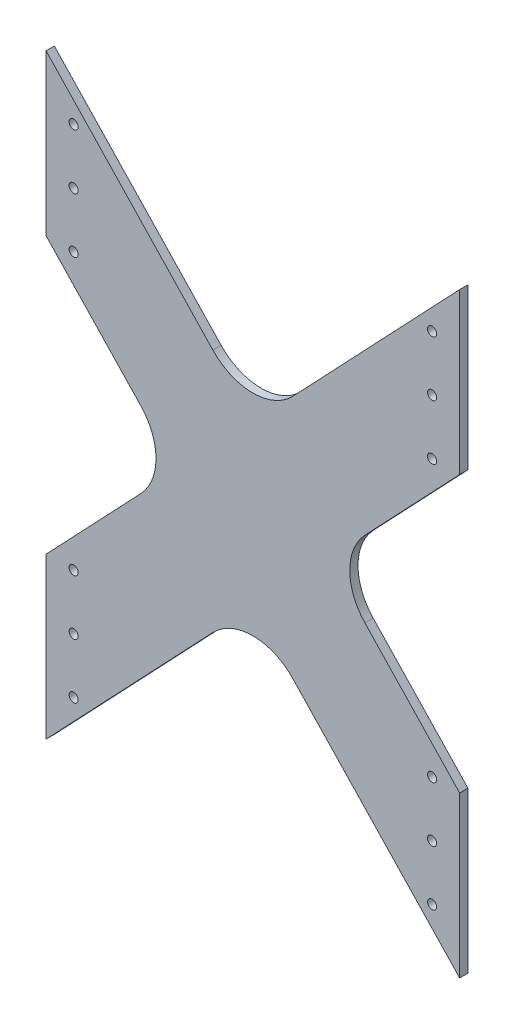
ISO-10303-21;
HEADER;
FILE_DESCRIPTION(('STEP AP214'),'2;1');
FILE_NAME('part.step','',(''),(''),'','','');
FILE_SCHEMA(('AUTOMOTIVE_DESIGN { 1 0 10303 214 1 1 1 1 }'));
ENDSEC;
DATA;
#1=APPLICATION_CONTEXT('core data for automotive mechanical design processes');
#2=APPLICATION_PROTOCOL_DEFINITION('international standard','automotive_design',2000,#1);
#3=PRODUCT_CONTEXT('',#1,'mechanical');
#4=PRODUCT('Part','Part','',(#3));
#5=PRODUCT_RELATED_PRODUCT_CATEGORY('part','',(#4));
#6=PRODUCT_DEFINITION_FORMATION('','',#4);
#7=PRODUCT_DEFINITION_CONTEXT('part definition',#1,'design');
#8=PRODUCT_DEFINITION('design','',#6,#7);
#9=PRODUCT_DEFINITION_SHAPE('','',#8);
#10=(LENGTH_UNIT() NAMED_UNIT(*) SI_UNIT(.MILLI.,.METRE.));
#11=(NAMED_UNIT(*) PLANE_ANGLE_UNIT() SI_UNIT($,.RADIAN.));
#12=(NAMED_UNIT(*) SI_UNIT($,.STERADIAN.) SOLID_ANGLE_UNIT());
#13=UNCERTAINTY_MEASURE_WITH_UNIT(LENGTH_MEASURE(1.E-05),#10,'distance_accuracy_value','');
#14=(GEOMETRIC_REPRESENTATION_CONTEXT(3) GLOBAL_UNCERTAINTY_ASSIGNED_CONTEXT((#13)) GLOBAL_UNIT_ASSIGNED_CONTEXT((#10,
#11,#12)) REPRESENTATION_CONTEXT('',''));
#15=CARTESIAN_POINT('',(0.,0.,0.));
#16=DIRECTION('',(0.,0.,1.));
#17=DIRECTION('',(1.,0.,0.));
#18=AXIS2_PLACEMENT_3D('',#15,#16,#17);
#19=CARTESIAN_POINT('',(-27.7267674180202,26.3033579146471,3.));
#20=DIRECTION('',(-0.725483608621301,0.688239444976684,0.));
#21=DIRECTION('',(-0.688239444976685,-0.725483608621301,0.));
#22=AXIS2_PLACEMENT_3D('',#19,#20,#21);
#23=PLANE('',#22);
#24=DIRECTION('',(0.688239444976685,0.725483608621301,0.));
#25=VECTOR('',#24,1.);
#26=CARTESIAN_POINT('',(-27.7267674180202,26.3033579146471,0.));
#27=LINE('',#26,#25);
#28=CARTESIAN_POINT('',(8.35018483751891,64.3326189537228,0.));
#29=VERTEX_POINT('',#28);
#30=CARTESIAN_POINT('',(68.8408597181721,128.096754271251,0.));
#31=VERTEX_POINT('',#30);
#32=EDGE_CURVE('E244',#29,#31,#27,.T.);
#33=ORIENTED_EDGE('',*,*,#32,.F.);
#34=DIRECTION('',(0.,0.,-1.));
#35=VECTOR('',#34,1.);
#36=CARTESIAN_POINT('',(8.35018483751891,64.3326189537228,3.));
#37=LINE('',#36,#35);
#38=CARTESIAN_POINT('',(8.35018483751891,64.3326189537228,3.));
#39=VERTEX_POINT('',#38);
#40=EDGE_CURVE('E58',#29,#39,#37,.F.);
#41=ORIENTED_EDGE('',*,*,#40,.T.);
#42=DIRECTION('',(0.688239444976685,0.725483608621301,0.));
#43=VECTOR('',#42,1.);
#44=CARTESIAN_POINT('',(-27.7267674180202,26.3033579146471,3.));
#45=LINE('',#44,#43);
#46=CARTESIAN_POINT('',(68.8408597181721,128.096754271251,3.));
#47=VERTEX_POINT('',#46);
#48=EDGE_CURVE('E165',#39,#47,#45,.T.);
#49=ORIENTED_EDGE('',*,*,#48,.T.);
#50=DIRECTION('',(0.,0.,-1.));
#51=VECTOR('',#50,1.);
#52=CARTESIAN_POINT('',(68.8408597181721,128.096754271251,3.));
#53=LINE('',#52,#51);
#54=EDGE_CURVE('E243',#47,#31,#53,.T.);
#55=ORIENTED_EDGE('',*,*,#54,.T.);
#56=EDGE_LOOP('',(#33,#41,#49,#55));
#57=FACE_BOUND('',#56,.T.);
#58=ADVANCED_FACE('F43',(#57),#23,.T.);
#59=CARTESIAN_POINT('',(21.2428723521481,20.1521710330634,3.));
#60=DIRECTION('',(-0.725486262647714,-0.688236647316497,0.));
#61=DIRECTION('',(0.688236647316497,-0.725486262647714,0.));
#62=AXIS2_PLACEMENT_3D('',#59,#60,#61);
#63=PLANE('',#62);
#64=DIRECTION('',(-0.688236647316497,0.725486262647714,0.));
#65=VECTOR('',#64,1.);
#66=CARTESIAN_POINT('',(21.2428723521481,20.1521710330634,3.));
#67=LINE('',#66,#65);
#68=CARTESIAN_POINT('',(-20.6692125878614,64.3326749069265,3.));
#69=VERTEX_POINT('',#68);
#70=CARTESIAN_POINT('',(-81.1596415768353,128.097043491889,3.));
#71=VERTEX_POINT('',#70);
#72=EDGE_CURVE('E153',#69,#71,#67,.T.);
#73=ORIENTED_EDGE('',*,*,#72,.F.);
#74=DIRECTION('',(0.,0.,-1.));
#75=VECTOR('',#74,1.);
#76=CARTESIAN_POINT('',(-20.6692125878614,64.3326749069265,3.));
#77=LINE('',#76,#75);
#78=CARTESIAN_POINT('',(-20.6692125878614,64.3326749069265,0.));
#79=VERTEX_POINT('',#78);
#80=EDGE_CURVE('E339',#69,#79,#77,.T.);
#81=ORIENTED_EDGE('',*,*,#80,.T.);
#82=DIRECTION('',(-0.688236647316497,0.725486262647714,0.));
#83=VECTOR('',#82,1.);
#84=CARTESIAN_POINT('',(21.2428723521481,20.1521710330634,0.));
#85=LINE('',#84,#83);
#86=CARTESIAN_POINT('',(-81.1596415768353,128.097043491889,0.));
#87=VERTEX_POINT('',#86);
#88=EDGE_CURVE('E170',#79,#87,#85,.T.);
#89=ORIENTED_EDGE('',*,*,#88,.T.);
#90=DIRECTION('',(0.,0.,-1.));
#91=VECTOR('',#90,1.);
#92=CARTESIAN_POINT('',(-81.1596415768353,128.097043491889,3.));
#93=LINE('',#92,#91);
#94=EDGE_CURVE('E168',#71,#87,#93,.T.);
#95=ORIENTED_EDGE('',*,*,#94,.F.);
#96=EDGE_LOOP('',(#73,#81,#89,#95));
#97=FACE_BOUND('',#96,.T.);
#98=ADVANCED_FACE('F169',(#97),#63,.F.);
#99=CARTESIAN_POINT('',(-81.1604606199397,0.000518936137093081,3.));
#100=DIRECTION('',(0.999999999979559,-6.39395258625454E-06,0.));
#101=DIRECTION('',(6.39395258625454E-06,0.999999999979559,0.));
#102=AXIS2_PLACEMENT_3D('',#99,#100,#101);
#103=PLANE('',#102);
#104=DIRECTION('',(-6.39395258625454E-06,-0.999999999979559,0.));
#105=VECTOR('',#104,1.);
#106=CARTESIAN_POINT('',(-81.1604606199397,0.000518936137093081,0.));
#107=LINE('',#106,#105);
#108=CARTESIAN_POINT('',(-81.1600131879383,69.9778913699945,0.));
#109=VERTEX_POINT('',#108);
#110=EDGE_CURVE('E247',#87,#109,#107,.T.);
#111=ORIENTED_EDGE('',*,*,#110,.T.);
#112=DIRECTION('',(0.,0.,-1.));
#113=VECTOR('',#112,1.);
#114=CARTESIAN_POINT('',(-81.1600131879383,69.9778913699945,3.));
#115=LINE('',#114,#113);
#116=CARTESIAN_POINT('',(-81.1600131879383,69.9778913699945,3.));
#117=VERTEX_POINT('',#116);
#118=EDGE_CURVE('E174',#117,#109,#115,.T.);
#119=ORIENTED_EDGE('',*,*,#118,.F.);
#120=DIRECTION('',(-6.39395258625454E-06,-0.999999999979559,0.));
#121=VECTOR('',#120,1.);
#122=CARTESIAN_POINT('',(-81.1604606199397,0.000518936137093081,3.));
#123=LINE('',#122,#121);
#124=EDGE_CURVE('E159',#71,#117,#123,.T.);
#125=ORIENTED_EDGE('',*,*,#124,.F.);
#126=ORIENTED_EDGE('',*,*,#94,.T.);
#127=EDGE_LOOP('',(#111,#119,#125,#126));
#128=FACE_BOUND('',#127,.T.);
#129=ADVANCED_FACE('F176',(#128),#103,.F.);
#130=CARTESIAN_POINT('',(-7.77657815376051,-7.37729485959649,3.));
#131=DIRECTION('',(0.725486262647714,0.688236647316497,0.));
#132=DIRECTION('',(-0.688236647316497,0.725486262647714,0.));
#133=AXIS2_PLACEMENT_3D('',#130,#131,#132);
#134=PLANE('',#133);
#135=DIRECTION('',(0.688236647316497,-0.725486262647714,0.));
#136=VECTOR('',#135,1.);
#137=CARTESIAN_POINT('',(-7.77657815376051,-7.37729485959649,0.));
#138=LINE('',#137,#136);
#139=CARTESIAN_POINT('',(-46.7854090600242,33.7428213893534,0.));
#140=VERTEX_POINT('',#139);
#141=EDGE_CURVE('E249',#109,#140,#138,.T.);
#142=ORIENTED_EDGE('',*,*,#141,.T.);
#143=DIRECTION('',(0.,0.,-1.));
#144=VECTOR('',#143,1.);
#145=CARTESIAN_POINT('',(-46.7854090600242,33.7428213893534,3.));
#146=LINE('',#145,#144);
#147=CARTESIAN_POINT('',(-46.7854090600242,33.7428213893534,3.));
#148=VERTEX_POINT('',#147);
#149=EDGE_CURVE('E327',#140,#148,#146,.F.);
#150=ORIENTED_EDGE('',*,*,#149,.T.);
#151=DIRECTION('',(0.688236647316497,-0.725486262647714,0.));
#152=VECTOR('',#151,1.);
#153=CARTESIAN_POINT('',(-7.77657815376051,-7.37729485959649,3.));
#154=LINE('',#153,#152);
#155=EDGE_CURVE('E179',#117,#148,#154,.T.);
#156=ORIENTED_EDGE('',*,*,#155,.F.);
#157=ORIENTED_EDGE('',*,*,#118,.T.);
#158=EDGE_LOOP('',(#142,#150,#156,#157));
#159=FACE_BOUND('',#158,.T.);
#160=ADVANCED_FACE('F402',(#159),#134,.F.);
#161=CARTESIAN_POINT('',(-27.7267674180203,26.303357914647,3.));
#162=DIRECTION('',(-0.725483608621303,0.688239444976682,0.));
#163=DIRECTION('',(-0.688239444976683,-0.725483608621303,0.));
#164=AXIS2_PLACEMENT_3D('',#161,#162,#163);
#165=PLANE('',#164);
#166=DIRECTION('',(0.688239444976683,0.725483608621303,0.));
#167=VECTOR('',#166,1.);
#168=CARTESIAN_POINT('',(-27.7267674180203,26.303357914647,3.));
#169=LINE('',#168,#167);
#170=CARTESIAN_POINT('',(-81.1606525831967,-30.0221086293432,3.));
#171=VERTEX_POINT('',#170);
#172=CARTESIAN_POINT('',(-46.7854621405524,6.21329954348978,3.));
#173=VERTEX_POINT('',#172);
#174=EDGE_CURVE('E181',#171,#173,#169,.T.);
#175=ORIENTED_EDGE('',*,*,#174,.T.);
#176=DIRECTION('',(0.,0.,-1.));
#177=VECTOR('',#176,1.);
#178=CARTESIAN_POINT('',(-46.7854621405524,6.21329954348978,3.));
#179=LINE('',#178,#177);
#180=CARTESIAN_POINT('',(-46.7854621405524,6.21329954348978,0.));
#181=VERTEX_POINT('',#180);
#182=EDGE_CURVE('E173',#173,#181,#179,.T.);
#183=ORIENTED_EDGE('',*,*,#182,.T.);
#184=DIRECTION('',(0.688239444976683,0.725483608621303,0.));
#185=VECTOR('',#184,1.);
#186=CARTESIAN_POINT('',(-27.7267674180203,26.303357914647,0.));
#187=LINE('',#186,#185);
#188=CARTESIAN_POINT('',(-81.1606525831967,-30.0221086293432,0.));
#189=VERTEX_POINT('',#188);
#190=EDGE_CURVE('E252',#189,#181,#187,.T.);
#191=ORIENTED_EDGE('',*,*,#190,.F.);
#192=DIRECTION('',(0.,0.,-1.));
#193=VECTOR('',#192,1.);
#194=CARTESIAN_POINT('',(-81.1606525831967,-30.0221086293432,3.));
#195=LINE('',#194,#193);
#196=EDGE_CURVE('E322',#171,#189,#195,.T.);
#197=ORIENTED_EDGE('',*,*,#196,.F.);
#198=EDGE_LOOP('',(#175,#183,#191,#197));
#199=FACE_BOUND('',#198,.T.);
#200=ADVANCED_FACE('F394',(#199),#165,.T.);
#201=CARTESIAN_POINT('',(-81.1604606199396,0.000518936136785701,3.));
#202=DIRECTION('',(-0.999999999979559,6.39395258246723E-06,0.));
#203=DIRECTION('',(-6.39395258246723E-06,-0.999999999979559,0.));
#204=AXIS2_PLACEMENT_3D('',#201,#202,#203);
#205=PLANE('',#204);
#206=DIRECTION('',(6.39395258246723E-06,0.999999999979559,0.));
#207=VECTOR('',#206,1.);
#208=CARTESIAN_POINT('',(-81.1604606199396,0.000518936136785701,0.));
#209=LINE('',#208,#207);
#210=CARTESIAN_POINT('',(-81.1610241977982,-88.1418079465734,0.));
#211=VERTEX_POINT('',#210);
#212=EDGE_CURVE('E255',#211,#189,#209,.T.);
#213=ORIENTED_EDGE('',*,*,#212,.F.);
#214=DIRECTION('',(0.,0.,-1.));
#215=VECTOR('',#214,1.);
#216=CARTESIAN_POINT('',(-81.1610241977982,-88.1418079465734,3.));
#217=LINE('',#216,#215);
#218=CARTESIAN_POINT('',(-81.1610241977982,-88.1418079465734,3.));
#219=VERTEX_POINT('',#218);
#220=EDGE_CURVE('E320',#219,#211,#217,.T.);
#221=ORIENTED_EDGE('',*,*,#220,.F.);
#222=DIRECTION('',(6.39395258246723E-06,0.999999999979559,0.));
#223=VECTOR('',#222,1.);
#224=CARTESIAN_POINT('',(-81.1604606199396,0.000518936136785701,3.));
#225=LINE('',#224,#223);
#226=EDGE_CURVE('E187',#219,#171,#225,.T.);
#227=ORIENTED_EDGE('',*,*,#226,.T.);
#228=ORIENTED_EDGE('',*,*,#196,.T.);
#229=EDGE_LOOP('',(#213,#221,#227,#228));
#230=FACE_BOUND('',#229,.T.);
#231=ADVANCED_FACE('F390',(#230),#205,.T.);
#232=CARTESIAN_POINT('',(1.29257692683187,-1.22621988442029,3.));
#233=DIRECTION('',(-0.725483608621303,0.688239444976682,0.));
#234=DIRECTION('',(-0.688239444976682,-0.725483608621303,0.));
#235=AXIS2_PLACEMENT_3D('',#232,#233,#234);
#236=PLANE('',#235);
#237=DIRECTION('',(0.688239444976682,0.725483608621303,0.));
#238=VECTOR('',#237,1.);
#239=CARTESIAN_POINT('',(1.29257692683187,-1.22621988442029,0.));
#240=LINE('',#239,#238);
#241=CARTESIAN_POINT('',(-20.6693836310819,-24.3766546847591,0.));
#242=VERTEX_POINT('',#241);
#243=EDGE_CURVE('E258',#211,#242,#240,.T.);
#244=ORIENTED_EDGE('',*,*,#243,.T.);
#245=DIRECTION('',(0.,0.,-1.));
#246=VECTOR('',#245,1.);
#247=CARTESIAN_POINT('',(-20.6693836310819,-24.3766546847591,3.));
#248=LINE('',#247,#246);
#249=CARTESIAN_POINT('',(-20.6693836310819,-24.3766546847591,3.));
#250=VERTEX_POINT('',#249);
#251=EDGE_CURVE('E332',#242,#250,#248,.F.);
#252=ORIENTED_EDGE('',*,*,#251,.T.);
#253=DIRECTION('',(0.688239444976682,0.725483608621303,0.));
#254=VECTOR('',#253,1.);
#255=CARTESIAN_POINT('',(1.29257692683187,-1.22621988442029,3.));
#256=LINE('',#255,#254);
#257=EDGE_CURVE('E190',#219,#250,#256,.T.);
#258=ORIENTED_EDGE('',*,*,#257,.F.);
#259=ORIENTED_EDGE('',*,*,#220,.T.);
#260=EDGE_LOOP('',(#244,#252,#258,#259));
#261=FACE_BOUND('',#260,.T.);
#262=ADVANCED_FACE('F386',(#261),#236,.F.);
#263=CARTESIAN_POINT('',(-7.77657815376049,-7.37729485959641,3.));
#264=DIRECTION('',(-0.725486262647716,-0.688236647316494,0.));
#265=DIRECTION('',(0.688236647316494,-0.725486262647716,0.));
#266=AXIS2_PLACEMENT_3D('',#263,#264,#265);
#267=PLANE('',#266);
#268=DIRECTION('',(-0.688236647316494,0.725486262647717,0.));
#269=VECTOR('',#268,1.);
#270=CARTESIAN_POINT('',(-7.77657815376049,-7.37729485959641,3.));
#271=LINE('',#270,#269);
#272=CARTESIAN_POINT('',(68.84140846541,-88.1420971709345,3.));
#273=VERTEX_POINT('',#272);
#274=CARTESIAN_POINT('',(8.35001379429845,-24.3767106379629,3.));
#275=VERTEX_POINT('',#274);
#276=EDGE_CURVE('E193',#273,#275,#271,.T.);
#277=ORIENTED_EDGE('',*,*,#276,.T.);
#278=DIRECTION('',(0.,0.,-1.));
#279=VECTOR('',#278,1.);
#280=CARTESIAN_POINT('',(8.35001379429844,-24.3767106379629,3.));
#281=LINE('',#280,#279);
#282=CARTESIAN_POINT('',(8.35001379429845,-24.3767106379629,0.));
#283=VERTEX_POINT('',#282);
#284=EDGE_CURVE('E329',#275,#283,#281,.T.);
#285=ORIENTED_EDGE('',*,*,#284,.T.);
#286=DIRECTION('',(-0.688236647316494,0.725486262647717,0.));
#287=VECTOR('',#286,1.);
#288=CARTESIAN_POINT('',(-7.77657815376049,-7.37729485959641,0.));
#289=LINE('',#288,#287);
#290=CARTESIAN_POINT('',(68.84140846541,-88.1420971709345,0.));
#291=VERTEX_POINT('',#290);
#292=EDGE_CURVE('E261',#291,#283,#289,.T.);
#293=ORIENTED_EDGE('',*,*,#292,.F.);
#294=DIRECTION('',(0.,0.,-1.));
#295=VECTOR('',#294,1.);
#296=CARTESIAN_POINT('',(68.84140846541,-88.1420971709345,3.));
#297=LINE('',#296,#295);
#298=EDGE_CURVE('E318',#273,#291,#297,.T.);
#299=ORIENTED_EDGE('',*,*,#298,.F.);
#300=EDGE_LOOP('',(#277,#285,#293,#299));
#301=FACE_BOUND('',#300,.T.);
#302=ADVANCED_FACE('F377',(#301),#267,.T.);
#303=CARTESIAN_POINT('',(68.841184787621,0.000174697607430225,3.));
#304=DIRECTION('',(-0.99999999999678,-2.53769030804183E-06,0.));
#305=DIRECTION('',(2.53769030804183E-06,-0.99999999999678,0.));
#306=AXIS2_PLACEMENT_3D('',#303,#304,#305);
#307=PLANE('',#306);
#308=DIRECTION('',(-2.53769030804183E-06,0.99999999999678,0.));
#309=VECTOR('',#308,1.);
#310=CARTESIAN_POINT('',(68.841184787621,0.000174697607430225,0.));
#311=LINE('',#310,#309);
#312=CARTESIAN_POINT('',(68.8412609756123,-30.0223978527034,0.));
#313=VERTEX_POINT('',#312);
#314=EDGE_CURVE('E264',#291,#313,#311,.T.);
#315=ORIENTED_EDGE('',*,*,#314,.T.);
#316=DIRECTION('',(0.,0.,-1.));
#317=VECTOR('',#316,1.);
#318=CARTESIAN_POINT('',(68.8412609756123,-30.0223978527034,3.));
#319=LINE('',#318,#317);
#320=CARTESIAN_POINT('',(68.8412609756123,-30.0223978527034,3.));
#321=VERTEX_POINT('',#320);
#322=EDGE_CURVE('E315',#321,#313,#319,.T.);
#323=ORIENTED_EDGE('',*,*,#322,.F.);
#324=DIRECTION('',(-2.53769030804183E-06,0.99999999999678,0.));
#325=VECTOR('',#324,1.);
#326=CARTESIAN_POINT('',(68.841184787621,0.000174697607430225,3.));
#327=LINE('',#326,#325);
#328=EDGE_CURVE('E196',#273,#321,#327,.T.);
#329=ORIENTED_EDGE('',*,*,#328,.F.);
#330=ORIENTED_EDGE('',*,*,#298,.T.);
#331=EDGE_LOOP('',(#315,#323,#329,#330));
#332=FACE_BOUND('',#331,.T.);
#333=ADVANCED_FACE('F373',(#332),#307,.F.);
#334=CARTESIAN_POINT('',(21.2428723521482,20.1521710330634,3.));
#335=DIRECTION('',(-0.725486262647716,-0.688236647316495,0.));
#336=DIRECTION('',(0.688236647316495,-0.725486262647716,0.));
#337=AXIS2_PLACEMENT_3D('',#334,#335,#336);
#338=PLANE('',#337);
#339=DIRECTION('',(-0.688236647316495,0.725486262647716,0.));
#340=VECTOR('',#339,1.);
#341=CARTESIAN_POINT('',(21.2428723521482,20.1521710330634,0.));
#342=LINE('',#341,#340);
#343=CARTESIAN_POINT('',(34.4662102664611,6.21314287961037,0.));
#344=VERTEX_POINT('',#343);
#345=EDGE_CURVE('E266',#313,#344,#342,.T.);
#346=ORIENTED_EDGE('',*,*,#345,.T.);
#347=DIRECTION('',(0.,0.,-1.));
#348=VECTOR('',#347,1.);
#349=CARTESIAN_POINT('',(34.4662102664611,6.21314287961037,3.));
#350=LINE('',#349,#348);
#351=CARTESIAN_POINT('',(34.4662102664611,6.21314287961037,3.));
#352=VERTEX_POINT('',#351);
#353=EDGE_CURVE('E337',#344,#352,#350,.F.);
#354=ORIENTED_EDGE('',*,*,#353,.T.);
#355=DIRECTION('',(-0.688236647316495,0.725486262647716,0.));
#356=VECTOR('',#355,1.);
#357=CARTESIAN_POINT('',(21.2428723521482,20.1521710330634,3.));
#358=LINE('',#357,#356);
#359=EDGE_CURVE('E198',#321,#352,#358,.T.);
#360=ORIENTED_EDGE('',*,*,#359,.F.);
#361=ORIENTED_EDGE('',*,*,#322,.T.);
#362=EDGE_LOOP('',(#346,#354,#360,#361));
#363=FACE_BOUND('',#362,.T.);
#364=ADVANCED_FACE('F369',(#363),#338,.F.);
#365=CARTESIAN_POINT('',(1.29257692683173,-1.22621988442018,3.));
#366=DIRECTION('',(0.725483608621299,-0.688239444976687,0.));
#367=DIRECTION('',(0.688239444976687,0.725483608621299,0.));
#368=AXIS2_PLACEMENT_3D('',#365,#366,#367);
#369=PLANE('',#368);
#370=DIRECTION('',(-0.688239444976687,-0.725483608621299,0.));
#371=VECTOR('',#370,1.);
#372=CARTESIAN_POINT('',(1.29257692683173,-1.22621988442018,3.));
#373=LINE('',#372,#371);
#374=CARTESIAN_POINT('',(68.8410072065813,69.9776021483565,3.));
#375=VERTEX_POINT('',#374);
#376=CARTESIAN_POINT('',(34.4662633469894,33.742664725474,3.));
#377=VERTEX_POINT('',#376);
#378=EDGE_CURVE('E201',#375,#377,#373,.T.);
#379=ORIENTED_EDGE('',*,*,#378,.T.);
#380=DIRECTION('',(0.,0.,-1.));
#381=VECTOR('',#380,1.);
#382=CARTESIAN_POINT('',(34.4662633469894,33.742664725474,3.));
#383=LINE('',#382,#381);
#384=CARTESIAN_POINT('',(34.4662633469894,33.742664725474,0.));
#385=VERTEX_POINT('',#384);
#386=EDGE_CURVE('E334',#377,#385,#383,.T.);
#387=ORIENTED_EDGE('',*,*,#386,.T.);
#388=DIRECTION('',(-0.688239444976687,-0.725483608621299,0.));
#389=VECTOR('',#388,1.);
#390=CARTESIAN_POINT('',(1.29257692683173,-1.22621988442018,0.));
#391=LINE('',#390,#389);
#392=CARTESIAN_POINT('',(68.8410072065813,69.9776021483565,0.));
#393=VERTEX_POINT('',#392);
#394=EDGE_CURVE('E269',#393,#385,#391,.T.);
#395=ORIENTED_EDGE('',*,*,#394,.F.);
#396=DIRECTION('',(0.,0.,-1.));
#397=VECTOR('',#396,1.);
#398=CARTESIAN_POINT('',(68.8410072065813,69.9776021483565,3.));
#399=LINE('',#398,#397);
#400=EDGE_CURVE('E313',#375,#393,#399,.T.);
#401=ORIENTED_EDGE('',*,*,#400,.F.);
#402=EDGE_LOOP('',(#379,#387,#395,#401));
#403=FACE_BOUND('',#402,.T.);
#404=ADVANCED_FACE('F361',(#403),#369,.T.);
#405=CARTESIAN_POINT('',(58.8409056988909,109.977620360612,3.));
#406=DIRECTION('',(0.,0.,-1.));
#407=DIRECTION('',(-1.,0.,0.));
#408=AXIS2_PLACEMENT_3D('',#405,#406,#407);
#409=CYLINDRICAL_SURFACE('',#408,1.64999999999997);
#410=CARTESIAN_POINT('',(58.8409056988909,109.977620360612,3.));
#411=DIRECTION('',(0.,0.,1.));
#412=DIRECTION('',(1.,0.,0.));
#413=AXIS2_PLACEMENT_3D('',#410,#411,#412);
#414=CIRCLE('',#413,1.64999999999997);
#415=CARTESIAN_POINT('',(60.4909056988909,109.977620360612,3.));
#416=VERTEX_POINT('',#415);
#417=EDGE_CURVE('E237',#416,#416,#414,.F.);
#418=ORIENTED_EDGE('',*,*,#417,.F.);
#419=EDGE_LOOP('',(#418));
#420=FACE_BOUND('',#419,.T.);
#421=CARTESIAN_POINT('',(58.8409056988909,109.977620360612,0.));
#422=DIRECTION('',(0.,0.,1.));
#423=DIRECTION('',(1.,0.,0.));
#424=AXIS2_PLACEMENT_3D('',#421,#422,#423);
#425=CIRCLE('',#424,1.64999999999997);
#426=CARTESIAN_POINT('',(60.4909056988909,109.977620360612,0.));
#427=VERTEX_POINT('',#426);
#428=EDGE_CURVE('E305',#427,#427,#425,.F.);
#429=ORIENTED_EDGE('',*,*,#428,.T.);
#430=EDGE_LOOP('',(#429));
#431=FACE_BOUND('',#430,.T.);
#432=ADVANCED_FACE('F582',(#420,#431),#409,.F.);
#433=CARTESIAN_POINT('',(58.8413117292885,-50.0223592900162,3.));
#434=DIRECTION('',(0.,0.,-1.));
#435=DIRECTION('',(-1.,0.,0.));
#436=AXIS2_PLACEMENT_3D('',#433,#434,#435);
#437=CYLINDRICAL_SURFACE('',#436,1.64999999999958);
#438=CARTESIAN_POINT('',(58.8413117292885,-50.0223592900162,3.));
#439=DIRECTION('',(0.,0.,1.));
#440=DIRECTION('',(1.,0.,0.));
#441=AXIS2_PLACEMENT_3D('',#438,#439,#440);
#442=CIRCLE('',#441,1.64999999999958);
#443=CARTESIAN_POINT('',(60.491311729288,-50.0223592900162,3.));
#444=VERTEX_POINT('',#443);
#445=EDGE_CURVE('E234',#444,#444,#442,.F.);
#446=ORIENTED_EDGE('',*,*,#445,.F.);
#447=EDGE_LOOP('',(#446));
#448=FACE_BOUND('',#447,.T.);
#449=CARTESIAN_POINT('',(58.8413117292885,-50.0223592900162,0.));
#450=DIRECTION('',(0.,0.,1.));
#451=DIRECTION('',(1.,0.,0.));
#452=AXIS2_PLACEMENT_3D('',#449,#450,#451);
#453=CIRCLE('',#452,1.64999999999958);
#454=CARTESIAN_POINT('',(60.491311729288,-50.0223592900162,0.));
#455=VERTEX_POINT('',#454);
#456=EDGE_CURVE('E302',#455,#455,#453,.F.);
#457=ORIENTED_EDGE('',*,*,#456,.T.);
#458=EDGE_LOOP('',(#457));
#459=FACE_BOUND('',#458,.T.);
#460=ADVANCED_FACE('F572',(#448,#459),#437,.F.);
#461=CARTESIAN_POINT('',(-71.1600131878644,69.9778710197565,3.));
#462=DIRECTION('',(0.,0.,-1.));
#463=DIRECTION('',(-1.,0.,0.));
#464=AXIS2_PLACEMENT_3D('',#461,#462,#463);
#465=CYLINDRICAL_SURFACE('',#464,1.65000000000002);
#466=CARTESIAN_POINT('',(-71.1600131878644,69.9778710197565,3.));
#467=DIRECTION('',(0.,0.,1.));
#468=DIRECTION('',(1.,0.,0.));
#469=AXIS2_PLACEMENT_3D('',#466,#467,#468);
#470=CIRCLE('',#469,1.65000000000002);
#471=CARTESIAN_POINT('',(-69.5100131878644,69.9778710197565,3.));
#472=VERTEX_POINT('',#471);
#473=EDGE_CURVE('E231',#472,#472,#470,.T.);
#474=ORIENTED_EDGE('',*,*,#473,.T.);
#475=EDGE_LOOP('',(#474));
#476=FACE_BOUND('',#475,.T.);
#477=CARTESIAN_POINT('',(-71.1600131878644,69.9778710197565,0.));
#478=DIRECTION('',(0.,0.,1.));
#479=DIRECTION('',(1.,0.,0.));
#480=AXIS2_PLACEMENT_3D('',#477,#478,#479);
#481=CIRCLE('',#480,1.65000000000002);
#482=CARTESIAN_POINT('',(-69.5100131878644,69.9778710197565,0.));
#483=VERTEX_POINT('',#482);
#484=EDGE_CURVE('E299',#483,#483,#481,.T.);
#485=ORIENTED_EDGE('',*,*,#484,.F.);
#486=EDGE_LOOP('',(#485));
#487=FACE_BOUND('',#486,.T.);
#488=ADVANCED_FACE('F562',(#476,#487),#465,.F.);
#489=CARTESIAN_POINT('',(-71.1598853088127,89.9778710193476,3.));
#490=DIRECTION('',(0.,0.,-1.));
#491=DIRECTION('',(-1.,0.,0.));
#492=AXIS2_PLACEMENT_3D('',#489,#490,#491);
#493=CYLINDRICAL_SURFACE('',#492,1.65000000000001);
#494=CARTESIAN_POINT('',(-71.1598853088127,89.9778710193476,3.));
#495=DIRECTION('',(0.,0.,1.));
#496=DIRECTION('',(1.,0.,0.));
#497=AXIS2_PLACEMENT_3D('',#494,#495,#496);
#498=CIRCLE('',#497,1.65000000000001);
#499=CARTESIAN_POINT('',(-69.5098853088127,89.9778710193476,3.));
#500=VERTEX_POINT('',#499);
#501=EDGE_CURVE('E228',#500,#500,#498,.T.);
#502=ORIENTED_EDGE('',*,*,#501,.T.);
#503=EDGE_LOOP('',(#502));
#504=FACE_BOUND('',#503,.T.);
#505=CARTESIAN_POINT('',(-71.1598853088127,89.9778710193476,0.));
#506=DIRECTION('',(0.,0.,1.));
#507=DIRECTION('',(1.,0.,0.));
#508=AXIS2_PLACEMENT_3D('',#505,#506,#507);
#509=CIRCLE('',#508,1.65000000000001);
#510=CARTESIAN_POINT('',(-69.5098853088127,89.9778710193476,0.));
#511=VERTEX_POINT('',#510);
#512=EDGE_CURVE('E296',#511,#511,#509,.T.);
#513=ORIENTED_EDGE('',*,*,#512,.F.);
#514=EDGE_LOOP('',(#513));
#515=FACE_BOUND('',#514,.T.);
#516=ADVANCED_FACE('F552',(#504,#515),#493,.F.);
#517=CARTESIAN_POINT('',(-71.159757429761,109.977871018939,3.));
#518=DIRECTION('',(0.,0.,-1.));
#519=DIRECTION('',(-1.,0.,0.));
#520=AXIS2_PLACEMENT_3D('',#517,#518,#519);
#521=CYLINDRICAL_SURFACE('',#520,1.65);
#522=CARTESIAN_POINT('',(-71.159757429761,109.977871018939,3.));
#523=DIRECTION('',(0.,0.,1.));
#524=DIRECTION('',(1.,0.,0.));
#525=AXIS2_PLACEMENT_3D('',#522,#523,#524);
#526=CIRCLE('',#525,1.65);
#527=CARTESIAN_POINT('',(-69.509757429761,109.977871018939,3.));
#528=VERTEX_POINT('',#527);
#529=EDGE_CURVE('E225',#528,#528,#526,.T.);
#530=ORIENTED_EDGE('',*,*,#529,.T.);
#531=EDGE_LOOP('',(#530));
#532=FACE_BOUND('',#531,.T.);
#533=CARTESIAN_POINT('',(-71.159757429761,109.977871018939,0.));
#534=DIRECTION('',(0.,0.,1.));
#535=DIRECTION('',(1.,0.,0.));
#536=AXIS2_PLACEMENT_3D('',#533,#534,#535);
#537=CIRCLE('',#536,1.65);
#538=CARTESIAN_POINT('',(-69.509757429761,109.977871018939,0.));
#539=VERTEX_POINT('',#538);
#540=EDGE_CURVE('E293',#539,#539,#537,.T.);
#541=ORIENTED_EDGE('',*,*,#540,.F.);
#542=EDGE_LOOP('',(#541));
#543=FACE_BOUND('',#542,.T.);
#544=ADVANCED_FACE('F542',(#532,#543),#521,.F.);
#545=CARTESIAN_POINT('',(-71.1606525831967,-30.0221086293432,3.));
#546=DIRECTION('',(0.,0.,-1.));
#547=DIRECTION('',(-1.,0.,0.));
#548=AXIS2_PLACEMENT_3D('',#545,#546,#547);
#549=CYLINDRICAL_SURFACE('',#548,1.64999999999959);
#550=CARTESIAN_POINT('',(-71.1606525831967,-30.0221086293432,3.));
#551=DIRECTION('',(0.,0.,1.));
#552=DIRECTION('',(1.,0.,0.));
#553=AXIS2_PLACEMENT_3D('',#550,#551,#552);
#554=CIRCLE('',#553,1.64999999999959);
#555=CARTESIAN_POINT('',(-69.5106525831971,-30.0221086293432,3.));
#556=VERTEX_POINT('',#555);
#557=EDGE_CURVE('E222',#556,#556,#554,.T.);
#558=ORIENTED_EDGE('',*,*,#557,.T.);
#559=EDGE_LOOP('',(#558));
#560=FACE_BOUND('',#559,.T.);
#561=CARTESIAN_POINT('',(-71.1606525831967,-30.0221086293432,0.));
#562=DIRECTION('',(0.,0.,1.));
#563=DIRECTION('',(1.,0.,0.));
#564=AXIS2_PLACEMENT_3D('',#561,#562,#563);
#565=CIRCLE('',#564,1.64999999999959);
#566=CARTESIAN_POINT('',(-69.5106525831971,-30.0221086293432,0.));
#567=VERTEX_POINT('',#566);
#568=EDGE_CURVE('E290',#567,#567,#565,.T.);
#569=ORIENTED_EDGE('',*,*,#568,.F.);
#570=EDGE_LOOP('',(#569));
#571=FACE_BOUND('',#570,.T.);
#572=ADVANCED_FACE('F532',(#560,#571),#549,.F.);
#573=CARTESIAN_POINT('',(-71.1607804620438,-50.0221086289342,3.));
#574=DIRECTION('',(0.,0.,-1.));
#575=DIRECTION('',(-1.,0.,0.));
#576=AXIS2_PLACEMENT_3D('',#573,#574,#575);
#577=CYLINDRICAL_SURFACE('',#576,1.64999999999938);
#578=CARTESIAN_POINT('',(-71.1607804620438,-50.0221086289342,3.));
#579=DIRECTION('',(0.,0.,1.));
#580=DIRECTION('',(1.,0.,0.));
#581=AXIS2_PLACEMENT_3D('',#578,#579,#580);
#582=CIRCLE('',#581,1.64999999999938);
#583=CARTESIAN_POINT('',(-69.5107804620444,-50.0221086289342,3.));
#584=VERTEX_POINT('',#583);
#585=EDGE_CURVE('E219',#584,#584,#582,.T.);
#586=ORIENTED_EDGE('',*,*,#585,.T.);
#587=EDGE_LOOP('',(#586));
#588=FACE_BOUND('',#587,.T.);
#589=CARTESIAN_POINT('',(-71.1607804620438,-50.0221086289342,0.));
#590=DIRECTION('',(0.,0.,1.));
#591=DIRECTION('',(1.,0.,0.));
#592=AXIS2_PLACEMENT_3D('',#589,#590,#591);
#593=CIRCLE('',#592,1.64999999999938);
#594=CARTESIAN_POINT('',(-69.5107804620444,-50.0221086289342,0.));
#595=VERTEX_POINT('',#594);
#596=EDGE_CURVE('E287',#595,#595,#593,.T.);
#597=ORIENTED_EDGE('',*,*,#596,.F.);
#598=EDGE_LOOP('',(#597));
#599=FACE_BOUND('',#598,.T.);
#600=ADVANCED_FACE('F522',(#588,#599),#577,.F.);
#601=CARTESIAN_POINT('',(-71.1609083410955,-70.0221086285254,3.));
#602=DIRECTION('',(0.,0.,-1.));
#603=DIRECTION('',(-1.,0.,0.));
#604=AXIS2_PLACEMENT_3D('',#601,#602,#603);
#605=CYLINDRICAL_SURFACE('',#604,1.64999999999938);
#606=CARTESIAN_POINT('',(-71.1609083410955,-70.0221086285254,3.));
#607=DIRECTION('',(0.,0.,1.));
#608=DIRECTION('',(1.,0.,0.));
#609=AXIS2_PLACEMENT_3D('',#606,#607,#608);
#610=CIRCLE('',#609,1.64999999999938);
#611=CARTESIAN_POINT('',(-69.5109083410961,-70.0221086285254,3.));
#612=VERTEX_POINT('',#611);
#613=EDGE_CURVE('E216',#612,#612,#610,.T.);
#614=ORIENTED_EDGE('',*,*,#613,.T.);
#615=EDGE_LOOP('',(#614));
#616=FACE_BOUND('',#615,.T.);
#617=CARTESIAN_POINT('',(-71.1609083410955,-70.0221086285254,0.));
#618=DIRECTION('',(0.,0.,1.));
#619=DIRECTION('',(1.,0.,0.));
#620=AXIS2_PLACEMENT_3D('',#617,#618,#619);
#621=CIRCLE('',#620,1.64999999999938);
#622=CARTESIAN_POINT('',(-69.5109083410961,-70.0221086285254,0.));
#623=VERTEX_POINT('',#622);
#624=EDGE_CURVE('E284',#623,#623,#621,.T.);
#625=ORIENTED_EDGE('',*,*,#624,.F.);
#626=EDGE_LOOP('',(#625));
#627=FACE_BOUND('',#626,.T.);
#628=ADVANCED_FACE('F512',(#616,#627),#605,.F.);
#629=CARTESIAN_POINT('',(58.8413624830946,-70.0223592899519,3.));
#630=DIRECTION('',(0.,0.,-1.));
#631=DIRECTION('',(-1.,0.,0.));
#632=AXIS2_PLACEMENT_3D('',#629,#630,#631);
#633=CYLINDRICAL_SURFACE('',#632,1.64999999999952);
#634=CARTESIAN_POINT('',(58.8413624830946,-70.0223592899519,3.));
#635=DIRECTION('',(0.,0.,1.));
#636=DIRECTION('',(1.,0.,0.));
#637=AXIS2_PLACEMENT_3D('',#634,#635,#636);
#638=CIRCLE('',#637,1.64999999999952);
#639=CARTESIAN_POINT('',(60.4913624830942,-70.0223592899519,3.));
#640=VERTEX_POINT('',#639);
#641=EDGE_CURVE('E213',#640,#640,#638,.F.);
#642=ORIENTED_EDGE('',*,*,#641,.F.);
#643=EDGE_LOOP('',(#642));
#644=FACE_BOUND('',#643,.T.);
#645=CARTESIAN_POINT('',(58.8413624830946,-70.0223592899519,0.));
#646=DIRECTION('',(0.,0.,1.));
#647=DIRECTION('',(1.,0.,0.));
#648=AXIS2_PLACEMENT_3D('',#645,#646,#647);
#649=CIRCLE('',#648,1.64999999999952);
#650=CARTESIAN_POINT('',(60.4913624830942,-70.0223592899519,0.));
#651=VERTEX_POINT('',#650);
#652=EDGE_CURVE('E281',#651,#651,#649,.F.);
#653=ORIENTED_EDGE('',*,*,#652,.T.);
#654=EDGE_LOOP('',(#653));
#655=FACE_BOUND('',#654,.T.);
#656=ADVANCED_FACE('F502',(#644,#655),#633,.F.);
#657=CARTESIAN_POINT('',(58.8412609756867,-30.0223592900806,3.));
#658=DIRECTION('',(0.,0.,-1.));
#659=DIRECTION('',(-1.,0.,0.));
#660=AXIS2_PLACEMENT_3D('',#657,#658,#659);
#661=CYLINDRICAL_SURFACE('',#660,1.64999999999958);
#662=CARTESIAN_POINT('',(58.8412609756867,-30.0223592900806,3.));
#663=DIRECTION('',(0.,0.,1.));
#664=DIRECTION('',(1.,0.,0.));
#665=AXIS2_PLACEMENT_3D('',#662,#663,#664);
#666=CIRCLE('',#665,1.64999999999958);
#667=CARTESIAN_POINT('',(60.4912609756863,-30.0223592900806,3.));
#668=VERTEX_POINT('',#667);
#669=EDGE_CURVE('E210',#668,#668,#666,.F.);
#670=ORIENTED_EDGE('',*,*,#669,.F.);
#671=EDGE_LOOP('',(#670));
#672=FACE_BOUND('',#671,.T.);
#673=CARTESIAN_POINT('',(58.8412609756867,-30.0223592900806,0.));
#674=DIRECTION('',(0.,0.,1.));
#675=DIRECTION('',(1.,0.,0.));
#676=AXIS2_PLACEMENT_3D('',#673,#674,#675);
#677=CIRCLE('',#676,1.64999999999958);
#678=CARTESIAN_POINT('',(60.4912609756863,-30.0223592900806,0.));
#679=VERTEX_POINT('',#678);
#680=EDGE_CURVE('E278',#679,#679,#677,.F.);
#681=ORIENTED_EDGE('',*,*,#680,.T.);
#682=EDGE_LOOP('',(#681));
#683=FACE_BOUND('',#682,.T.);
#684=ADVANCED_FACE('F492',(#672,#683),#661,.F.);
#685=CARTESIAN_POINT('',(58.8409564526971,89.9776203606768,3.));
#686=DIRECTION('',(0.,0.,-1.));
#687=DIRECTION('',(-1.,0.,0.));
#688=AXIS2_PLACEMENT_3D('',#685,#686,#687);
#689=CYLINDRICAL_SURFACE('',#688,1.65000000000003);
#690=CARTESIAN_POINT('',(58.8409564526971,89.9776203606768,3.));
#691=DIRECTION('',(0.,0.,1.));
#692=DIRECTION('',(1.,0.,0.));
#693=AXIS2_PLACEMENT_3D('',#690,#691,#692);
#694=CIRCLE('',#693,1.65000000000003);
#695=CARTESIAN_POINT('',(60.4909564526971,89.9776203606768,3.));
#696=VERTEX_POINT('',#695);
#697=EDGE_CURVE('E207',#696,#696,#694,.F.);
#698=ORIENTED_EDGE('',*,*,#697,.F.);
#699=EDGE_LOOP('',(#698));
#700=FACE_BOUND('',#699,.T.);
#701=CARTESIAN_POINT('',(58.8409564526971,89.9776203606768,0.));
#702=DIRECTION('',(0.,0.,1.));
#703=DIRECTION('',(1.,0.,0.));
#704=AXIS2_PLACEMENT_3D('',#701,#702,#703);
#705=CIRCLE('',#704,1.65000000000003);
#706=CARTESIAN_POINT('',(60.4909564526971,89.9776203606768,0.));
#707=VERTEX_POINT('',#706);
#708=EDGE_CURVE('E275',#707,#707,#705,.F.);
#709=ORIENTED_EDGE('',*,*,#708,.T.);
#710=EDGE_LOOP('',(#709));
#711=FACE_BOUND('',#710,.T.);
#712=ADVANCED_FACE('F482',(#700,#711),#689,.F.);
#713=CARTESIAN_POINT('',(68.841184787621,0.000174697607710682,3.));
#714=DIRECTION('',(0.99999999999678,2.5376903121158E-06,0.));
#715=DIRECTION('',(-2.5376903121158E-06,0.99999999999678,0.));
#716=AXIS2_PLACEMENT_3D('',#713,#714,#715);
#717=PLANE('',#716);
#718=DIRECTION('',(2.5376903121158E-06,-0.99999999999678,0.));
#719=VECTOR('',#718,1.);
#720=CARTESIAN_POINT('',(68.841184787621,0.000174697607710682,0.));
#721=LINE('',#720,#719);
#722=EDGE_CURVE('E272',#31,#393,#721,.T.);
#723=ORIENTED_EDGE('',*,*,#722,.F.);
#724=ORIENTED_EDGE('',*,*,#54,.F.);
#725=DIRECTION('',(2.5376903121158E-06,-0.99999999999678,0.));
#726=VECTOR('',#725,1.);
#727=CARTESIAN_POINT('',(68.841184787621,0.000174697607710682,3.));
#728=LINE('',#727,#726);
#729=EDGE_CURVE('E204',#47,#375,#728,.T.);
#730=ORIENTED_EDGE('',*,*,#729,.T.);
#731=ORIENTED_EDGE('',*,*,#400,.T.);
#732=EDGE_LOOP('',(#723,#724,#730,#731));
#733=FACE_BOUND('',#732,.T.);
#734=ADVANCED_FACE('F472',(#733),#717,.T.);
#735=CARTESIAN_POINT('',(58.8410072065033,69.9776203607412,3.));
#736=DIRECTION('',(0.,0.,-1.));
#737=DIRECTION('',(-1.,0.,0.));
#738=AXIS2_PLACEMENT_3D('',#735,#736,#737);
#739=CYLINDRICAL_SURFACE('',#738,1.65);
#740=CARTESIAN_POINT('',(58.8410072065033,69.9776203607412,3.));
#741=DIRECTION('',(0.,0.,1.));
#742=DIRECTION('',(1.,0.,0.));
#743=AXIS2_PLACEMENT_3D('',#740,#741,#742);
#744=CIRCLE('',#743,1.65);
#745=CARTESIAN_POINT('',(60.4910072065033,69.9776203607412,3.));
#746=VERTEX_POINT('',#745);
#747=EDGE_CURVE('E240',#746,#746,#744,.F.);
#748=ORIENTED_EDGE('',*,*,#747,.F.);
#749=EDGE_LOOP('',(#748));
#750=FACE_BOUND('',#749,.T.);
#751=CARTESIAN_POINT('',(58.8410072065033,69.9776203607412,0.));
#752=DIRECTION('',(0.,0.,1.));
#753=DIRECTION('',(1.,0.,0.));
#754=AXIS2_PLACEMENT_3D('',#751,#752,#753);
#755=CIRCLE('',#754,1.65);
#756=CARTESIAN_POINT('',(60.4910072065033,69.9776203607412,0.));
#757=VERTEX_POINT('',#756);
#758=EDGE_CURVE('E308',#757,#757,#755,.F.);
#759=ORIENTED_EDGE('',*,*,#758,.T.);
#760=EDGE_LOOP('',(#759));
#761=FACE_BOUND('',#760,.T.);
#762=ADVANCED_FACE('F463',(#750,#761),#739,.F.);
#763=CARTESIAN_POINT('',(0.,0.,3.));
#764=DIRECTION('',(0.,0.,1.));
#765=DIRECTION('',(1.,0.,0.));
#766=AXIS2_PLACEMENT_3D('',#763,#764,#765);
#767=PLANE('',#766);
#768=ORIENTED_EDGE('',*,*,#48,.F.);
#769=CARTESIAN_POINT('',(-6.1594873349071,78.0974078532564,3.));
#770=DIRECTION('',(0.,0.,1.));
#771=DIRECTION('',(1.,0.,0.));
#772=AXIS2_PLACEMENT_3D('',#769,#770,#771);
#773=CIRCLE('',#772,20.);
#774=EDGE_CURVE('E11',#39,#69,#773,.F.);
#775=ORIENTED_EDGE('',*,*,#774,.T.);
#776=ORIENTED_EDGE('',*,*,#72,.T.);
#777=ORIENTED_EDGE('',*,*,#124,.T.);
#778=ORIENTED_EDGE('',*,*,#155,.T.);
#779=CARTESIAN_POINT('',(-61.2951343129785,19.9780884430234,3.));
#780=DIRECTION('',(0.,0.,1.));
#781=DIRECTION('',(1.,0.,0.));
#782=AXIS2_PLACEMENT_3D('',#779,#780,#781);
#783=CIRCLE('',#782,20.);
#784=EDGE_CURVE('E344',#148,#173,#783,.F.);
#785=ORIENTED_EDGE('',*,*,#784,.T.);
#786=ORIENTED_EDGE('',*,*,#174,.F.);
#787=ORIENTED_EDGE('',*,*,#226,.F.);
#788=ORIENTED_EDGE('',*,*,#257,.T.);
#789=CARTESIAN_POINT('',(-6.15971145865588,-38.1414435842927,3.));
#790=DIRECTION('',(0.,0.,1.));
#791=DIRECTION('',(1.,0.,0.));
#792=AXIS2_PLACEMENT_3D('',#789,#790,#791);
#793=CIRCLE('',#792,20.);
#794=EDGE_CURVE('E348',#250,#275,#793,.F.);
#795=ORIENTED_EDGE('',*,*,#794,.T.);
#796=ORIENTED_EDGE('',*,*,#276,.F.);
#797=ORIENTED_EDGE('',*,*,#328,.T.);
#798=ORIENTED_EDGE('',*,*,#359,.T.);
#799=CARTESIAN_POINT('',(48.9759355194154,19.9778758259403,3.));
#800=DIRECTION('',(0.,0.,1.));
#801=DIRECTION('',(1.,0.,0.));
#802=AXIS2_PLACEMENT_3D('',#799,#800,#801);
#803=CIRCLE('',#802,20.);
#804=EDGE_CURVE('E352',#352,#377,#803,.F.);
#805=ORIENTED_EDGE('',*,*,#804,.T.);
#806=ORIENTED_EDGE('',*,*,#378,.F.);
#807=ORIENTED_EDGE('',*,*,#729,.F.);
#808=EDGE_LOOP('',(#768,#775,#776,#777,#778,#785,#786,#787,#788,#795,#796,#797,#798,#805,#806,#807));
#809=FACE_BOUND('',#808,.T.);
#810=ORIENTED_EDGE('',*,*,#697,.T.);
#811=EDGE_LOOP('',(#810));
#812=FACE_BOUND('',#811,.T.);
#813=ORIENTED_EDGE('',*,*,#669,.T.);
#814=EDGE_LOOP('',(#813));
#815=FACE_BOUND('',#814,.T.);
#816=ORIENTED_EDGE('',*,*,#641,.T.);
#817=EDGE_LOOP('',(#816));
#818=FACE_BOUND('',#817,.T.);
#819=ORIENTED_EDGE('',*,*,#613,.F.);
#820=EDGE_LOOP('',(#819));
#821=FACE_BOUND('',#820,.T.);
#822=ORIENTED_EDGE('',*,*,#585,.F.);
#823=EDGE_LOOP('',(#822));
#824=FACE_BOUND('',#823,.T.);
#825=ORIENTED_EDGE('',*,*,#557,.F.);
#826=EDGE_LOOP('',(#825));
#827=FACE_BOUND('',#826,.T.);
#828=ORIENTED_EDGE('',*,*,#529,.F.);
#829=EDGE_LOOP('',(#828));
#830=FACE_BOUND('',#829,.T.);
#831=ORIENTED_EDGE('',*,*,#501,.F.);
#832=EDGE_LOOP('',(#831));
#833=FACE_BOUND('',#832,.T.);
#834=ORIENTED_EDGE('',*,*,#473,.F.);
#835=EDGE_LOOP('',(#834));
#836=FACE_BOUND('',#835,.T.);
#837=ORIENTED_EDGE('',*,*,#445,.T.);
#838=EDGE_LOOP('',(#837));
#839=FACE_BOUND('',#838,.T.);
#840=ORIENTED_EDGE('',*,*,#417,.T.);
#841=EDGE_LOOP('',(#840));
#842=FACE_BOUND('',#841,.T.);
#843=ORIENTED_EDGE('',*,*,#747,.T.);
#844=EDGE_LOOP('',(#843));
#845=FACE_BOUND('',#844,.T.);
#846=ADVANCED_FACE('F155',(#809,#812,#815,#818,#821,#824,#827,#830,#833,#836,#839,#842,#845),
#767,.T.);
#847=CARTESIAN_POINT('',(0.,0.,0.));
#848=DIRECTION('',(0.,0.,1.));
#849=DIRECTION('',(1.,0.,0.));
#850=AXIS2_PLACEMENT_3D('',#847,#848,#849);
#851=PLANE('',#850);
#852=ORIENTED_EDGE('',*,*,#88,.F.);
#853=CARTESIAN_POINT('',(-6.1594873349071,78.0974078532564,0.));
#854=DIRECTION('',(0.,0.,1.));
#855=DIRECTION('',(1.,0.,0.));
#856=AXIS2_PLACEMENT_3D('',#853,#854,#855);
#857=CIRCLE('',#856,20.);
#858=EDGE_CURVE('E51',#79,#29,#857,.T.);
#859=ORIENTED_EDGE('',*,*,#858,.T.);
#860=ORIENTED_EDGE('',*,*,#32,.T.);
#861=ORIENTED_EDGE('',*,*,#722,.T.);
#862=ORIENTED_EDGE('',*,*,#394,.T.);
#863=CARTESIAN_POINT('',(48.9759355194154,19.9778758259403,0.));
#864=DIRECTION('',(0.,0.,1.));
#865=DIRECTION('',(1.,0.,0.));
#866=AXIS2_PLACEMENT_3D('',#863,#864,#865);
#867=CIRCLE('',#866,20.);
#868=EDGE_CURVE('E350',#385,#344,#867,.T.);
#869=ORIENTED_EDGE('',*,*,#868,.T.);
#870=ORIENTED_EDGE('',*,*,#345,.F.);
#871=ORIENTED_EDGE('',*,*,#314,.F.);
#872=ORIENTED_EDGE('',*,*,#292,.T.);
#873=CARTESIAN_POINT('',(-6.15971145865588,-38.1414435842927,0.));
#874=DIRECTION('',(0.,0.,1.));
#875=DIRECTION('',(1.,0.,0.));
#876=AXIS2_PLACEMENT_3D('',#873,#874,#875);
#877=CIRCLE('',#876,20.);
#878=EDGE_CURVE('E346',#283,#242,#877,.T.);
#879=ORIENTED_EDGE('',*,*,#878,.T.);
#880=ORIENTED_EDGE('',*,*,#243,.F.);
#881=ORIENTED_EDGE('',*,*,#212,.T.);
#882=ORIENTED_EDGE('',*,*,#190,.T.);
#883=CARTESIAN_POINT('',(-61.2951343129785,19.9780884430234,0.));
#884=DIRECTION('',(0.,0.,1.));
#885=DIRECTION('',(1.,0.,0.));
#886=AXIS2_PLACEMENT_3D('',#883,#884,#885);
#887=CIRCLE('',#886,20.);
#888=EDGE_CURVE('E342',#181,#140,#887,.T.);
#889=ORIENTED_EDGE('',*,*,#888,.T.);
#890=ORIENTED_EDGE('',*,*,#141,.F.);
#891=ORIENTED_EDGE('',*,*,#110,.F.);
#892=EDGE_LOOP('',(#852,#859,#860,#861,#862,#869,#870,#871,#872,#879,#880,#881,#882,#889,#890,#891));
#893=FACE_BOUND('',#892,.T.);
#894=ORIENTED_EDGE('',*,*,#708,.F.);
#895=EDGE_LOOP('',(#894));
#896=FACE_BOUND('',#895,.T.);
#897=ORIENTED_EDGE('',*,*,#680,.F.);
#898=EDGE_LOOP('',(#897));
#899=FACE_BOUND('',#898,.T.);
#900=ORIENTED_EDGE('',*,*,#652,.F.);
#901=EDGE_LOOP('',(#900));
#902=FACE_BOUND('',#901,.T.);
#903=ORIENTED_EDGE('',*,*,#624,.T.);
#904=EDGE_LOOP('',(#903));
#905=FACE_BOUND('',#904,.T.);
#906=ORIENTED_EDGE('',*,*,#596,.T.);
#907=EDGE_LOOP('',(#906));
#908=FACE_BOUND('',#907,.T.);
#909=ORIENTED_EDGE('',*,*,#568,.T.);
#910=EDGE_LOOP('',(#909));
#911=FACE_BOUND('',#910,.T.);
#912=ORIENTED_EDGE('',*,*,#540,.T.);
#913=EDGE_LOOP('',(#912));
#914=FACE_BOUND('',#913,.T.);
#915=ORIENTED_EDGE('',*,*,#512,.T.);
#916=EDGE_LOOP('',(#915));
#917=FACE_BOUND('',#916,.T.);
#918=ORIENTED_EDGE('',*,*,#484,.T.);
#919=EDGE_LOOP('',(#918));
#920=FACE_BOUND('',#919,.T.);
#921=ORIENTED_EDGE('',*,*,#456,.F.);
#922=EDGE_LOOP('',(#921));
#923=FACE_BOUND('',#922,.T.);
#924=ORIENTED_EDGE('',*,*,#428,.F.);
#925=EDGE_LOOP('',(#924));
#926=FACE_BOUND('',#925,.T.);
#927=ORIENTED_EDGE('',*,*,#758,.F.);
#928=EDGE_LOOP('',(#927));
#929=FACE_BOUND('',#928,.T.);
#930=ADVANCED_FACE('F365',(#893,#896,#899,#902,#905,#908,#911,#914,#917,#920,#923,#926,#929),
#851,.F.);
#931=CARTESIAN_POINT('',(-61.2951343129785,19.9780884430234,3.));
#932=DIRECTION('',(0.,0.,-1.));
#933=DIRECTION('',(-1.,0.,0.));
#934=AXIS2_PLACEMENT_3D('',#931,#932,#933);
#935=CYLINDRICAL_SURFACE('',#934,20.);
#936=ORIENTED_EDGE('',*,*,#784,.F.);
#937=ORIENTED_EDGE('',*,*,#149,.F.);
#938=ORIENTED_EDGE('',*,*,#888,.F.);
#939=ORIENTED_EDGE('',*,*,#182,.F.);
#940=EDGE_LOOP('',(#936,#937,#938,#939));
#941=FACE_BOUND('',#940,.T.);
#942=ADVANCED_FACE('F399',(#941),#935,.F.);
#943=CARTESIAN_POINT('',(-6.15971145865588,-38.1414435842927,3.));
#944=DIRECTION('',(0.,0.,-1.));
#945=DIRECTION('',(-1.,0.,0.));
#946=AXIS2_PLACEMENT_3D('',#943,#944,#945);
#947=CYLINDRICAL_SURFACE('',#946,20.);
#948=ORIENTED_EDGE('',*,*,#794,.F.);
#949=ORIENTED_EDGE('',*,*,#251,.F.);
#950=ORIENTED_EDGE('',*,*,#878,.F.);
#951=ORIENTED_EDGE('',*,*,#284,.F.);
#952=EDGE_LOOP('',(#948,#949,#950,#951));
#953=FACE_BOUND('',#952,.T.);
#954=ADVANCED_FACE('F381',(#953),#947,.F.);
#955=CARTESIAN_POINT('',(48.9759355194154,19.9778758259403,3.));
#956=DIRECTION('',(0.,0.,-1.));
#957=DIRECTION('',(-1.,0.,0.));
#958=AXIS2_PLACEMENT_3D('',#955,#956,#957);
#959=CYLINDRICAL_SURFACE('',#958,20.);
#960=ORIENTED_EDGE('',*,*,#804,.F.);
#961=ORIENTED_EDGE('',*,*,#353,.F.);
#962=ORIENTED_EDGE('',*,*,#868,.F.);
#963=ORIENTED_EDGE('',*,*,#386,.F.);
#964=EDGE_LOOP('',(#960,#961,#962,#963));
#965=FACE_BOUND('',#964,.T.);
#966=ADVANCED_FACE('F363',(#965),#959,.F.);
#967=CARTESIAN_POINT('',(-6.1594873349071,78.0974078532564,3.));
#968=DIRECTION('',(0.,0.,-1.));
#969=DIRECTION('',(-1.,0.,0.));
#970=AXIS2_PLACEMENT_3D('',#967,#968,#969);
#971=CYLINDRICAL_SURFACE('',#970,20.);
#972=ORIENTED_EDGE('',*,*,#774,.F.);
#973=ORIENTED_EDGE('',*,*,#40,.F.);
#974=ORIENTED_EDGE('',*,*,#858,.F.);
#975=ORIENTED_EDGE('',*,*,#80,.F.);
#976=EDGE_LOOP('',(#972,#973,#974,#975));
#977=FACE_BOUND('',#976,.T.);
#978=ADVANCED_FACE('F45',(#977),#971,.F.);
#979=CLOSED_SHELL('',(#58,#98,#129,#160,#200,#231,#262,#302,#333,#364,#404,#432,#460,#488,#516,
#544,#572,#600,#628,#656,#684,#712,#734,#762,#846,#930,#942,#954,#966,#978));
#980=MANIFOLD_SOLID_BREP('B2',#979);
#981=ADVANCED_BREP_SHAPE_REPRESENTATION('',(#18,#980),#14);
#982=SHAPE_DEFINITION_REPRESENTATION(#9,#981);
ENDSEC;
END-ISO-10303-21;
